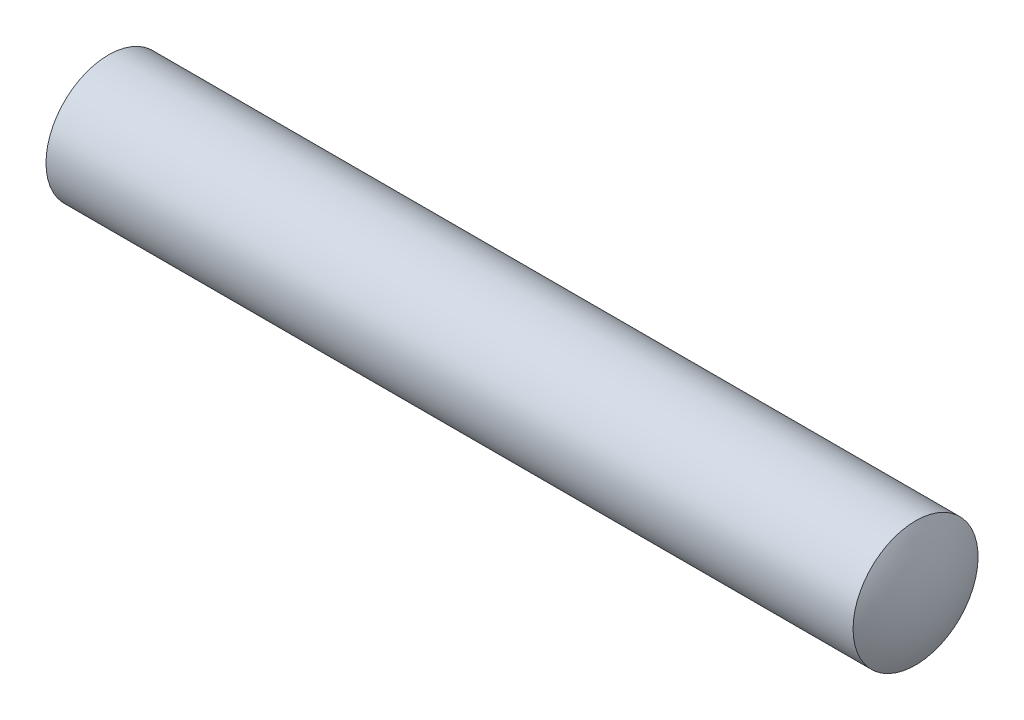
ISO-10303-21;
HEADER;
FILE_DESCRIPTION(('STEP AP214'),'2;1');
FILE_NAME('part.step','',(''),(''),'','','');
FILE_SCHEMA(('AUTOMOTIVE_DESIGN { 1 0 10303 214 1 1 1 1 }'));
ENDSEC;
DATA;
#1=APPLICATION_CONTEXT('core data for automotive mechanical design processes');
#2=APPLICATION_PROTOCOL_DEFINITION('international standard','automotive_design',2000,#1);
#3=PRODUCT_CONTEXT('',#1,'mechanical');
#4=PRODUCT('Part','Part','',(#3));
#5=PRODUCT_RELATED_PRODUCT_CATEGORY('part','',(#4));
#6=PRODUCT_DEFINITION_FORMATION('','',#4);
#7=PRODUCT_DEFINITION_CONTEXT('part definition',#1,'design');
#8=PRODUCT_DEFINITION('design','',#6,#7);
#9=PRODUCT_DEFINITION_SHAPE('','',#8);
#10=(LENGTH_UNIT() NAMED_UNIT(*) SI_UNIT(.MILLI.,.METRE.));
#11=(NAMED_UNIT(*) PLANE_ANGLE_UNIT() SI_UNIT($,.RADIAN.));
#12=(NAMED_UNIT(*) SI_UNIT($,.STERADIAN.) SOLID_ANGLE_UNIT());
#13=UNCERTAINTY_MEASURE_WITH_UNIT(LENGTH_MEASURE(1.E-05),#10,'distance_accuracy_value','');
#14=(GEOMETRIC_REPRESENTATION_CONTEXT(3) GLOBAL_UNCERTAINTY_ASSIGNED_CONTEXT((#13)) GLOBAL_UNIT_ASSIGNED_CONTEXT((#10,
#11,#12)) REPRESENTATION_CONTEXT('',''));
#15=CARTESIAN_POINT('',(0.,0.,0.));
#16=DIRECTION('',(0.,0.,1.));
#17=DIRECTION('',(1.,0.,0.));
#18=AXIS2_PLACEMENT_3D('',#15,#16,#17);
#19=CARTESIAN_POINT('',(6.,0.,0.));
#20=DIRECTION('',(-1.,0.,0.));
#21=DIRECTION('',(0.,1.,0.));
#22=AXIS2_PLACEMENT_3D('',#19,#20,#21);
#23=SPHERICAL_SURFACE('',#22,6.);
#24=CARTESIAN_POINT('',(0.789493786588484,0.,0.));
#25=DIRECTION('',(-1.,0.,0.));
#26=DIRECTION('',(0.,0.,1.));
#27=AXIS2_PLACEMENT_3D('',#24,#25,#26);
#28=CIRCLE('',#27,2.975);
#29=CARTESIAN_POINT('',(0.789493786588484,0.,2.975));
#30=VERTEX_POINT('',#29);
#31=EDGE_CURVE('E37',#30,#30,#28,.T.);
#32=ORIENTED_EDGE('',*,*,#31,.T.);
#33=EDGE_LOOP('',(#32));
#34=FACE_BOUND('',#33,.T.);
#35=ADVANCED_FACE('F31',(#34),#23,.T.);
#36=CARTESIAN_POINT('',(34.,0.,0.));
#37=DIRECTION('',(-1.,0.,0.));
#38=DIRECTION('',(0.,1.,0.));
#39=AXIS2_PLACEMENT_3D('',#36,#37,#38);
#40=SPHERICAL_SURFACE('',#39,6.);
#41=CARTESIAN_POINT('',(39.2105062134115,0.,0.));
#42=DIRECTION('',(-1.,0.,0.));
#43=DIRECTION('',(0.,0.,1.));
#44=AXIS2_PLACEMENT_3D('',#41,#42,#43);
#45=CIRCLE('',#44,2.975);
#46=CARTESIAN_POINT('',(39.2105062134115,0.,2.975));
#47=VERTEX_POINT('',#46);
#48=EDGE_CURVE('E10',#47,#47,#45,.T.);
#49=ORIENTED_EDGE('',*,*,#48,.F.);
#50=EDGE_LOOP('',(#49));
#51=FACE_BOUND('',#50,.T.);
#52=ADVANCED_FACE('F46',(#51),#40,.T.);
#53=CARTESIAN_POINT('',(18.,0.,0.));
#54=DIRECTION('',(-1.,0.,0.));
#55=DIRECTION('',(0.,0.,1.));
#56=AXIS2_PLACEMENT_3D('',#53,#54,#55);
#57=CYLINDRICAL_SURFACE('',#56,2.975);
#58=ORIENTED_EDGE('',*,*,#31,.F.);
#59=EDGE_LOOP('',(#58));
#60=FACE_BOUND('',#59,.T.);
#61=ORIENTED_EDGE('',*,*,#48,.T.);
#62=EDGE_LOOP('',(#61));
#63=FACE_BOUND('',#62,.T.);
#64=ADVANCED_FACE('F44',(#60,#63),#57,.T.);
#65=CLOSED_SHELL('',(#35,#52,#64));
#66=MANIFOLD_SOLID_BREP('B2',#65);
#67=ADVANCED_BREP_SHAPE_REPRESENTATION('',(#18,#66),#14);
#68=SHAPE_DEFINITION_REPRESENTATION(#9,#67);
ENDSEC;
END-ISO-10303-21;
